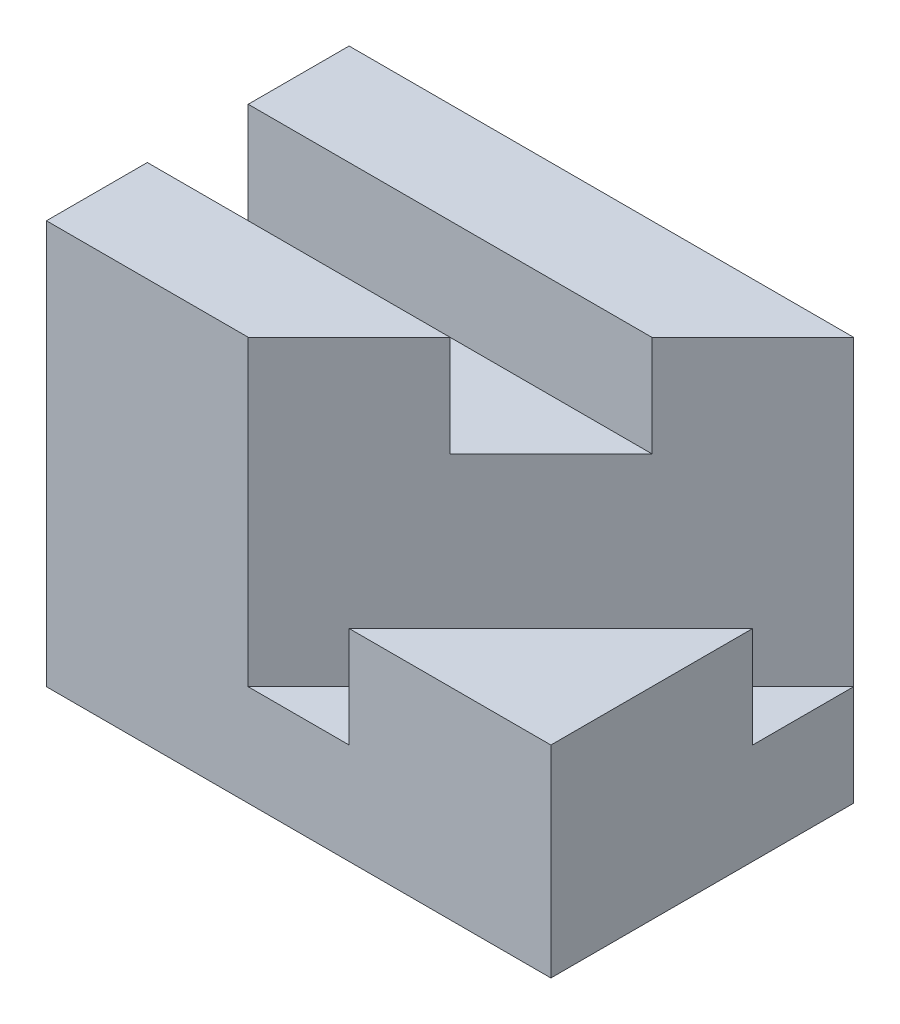
ISO-10303-21;
HEADER;
FILE_DESCRIPTION(('STEP AP214'),'2;1');
FILE_NAME('part.step','',(''),(''),'','','');
FILE_SCHEMA(('AUTOMOTIVE_DESIGN { 1 0 10303 214 1 1 1 1 }'));
ENDSEC;
DATA;
#1=APPLICATION_CONTEXT('core data for automotive mechanical design processes');
#2=APPLICATION_PROTOCOL_DEFINITION('international standard','automotive_design',2000,#1);
#3=PRODUCT_CONTEXT('',#1,'mechanical');
#4=PRODUCT('Part','Part','',(#3));
#5=PRODUCT_RELATED_PRODUCT_CATEGORY('part','',(#4));
#6=PRODUCT_DEFINITION_FORMATION('','',#4);
#7=PRODUCT_DEFINITION_CONTEXT('part definition',#1,'design');
#8=PRODUCT_DEFINITION('design','',#6,#7);
#9=PRODUCT_DEFINITION_SHAPE('','',#8);
#10=(LENGTH_UNIT() NAMED_UNIT(*) SI_UNIT(.MILLI.,.METRE.));
#11=(NAMED_UNIT(*) PLANE_ANGLE_UNIT() SI_UNIT($,.RADIAN.));
#12=(NAMED_UNIT(*) SI_UNIT($,.STERADIAN.) SOLID_ANGLE_UNIT());
#13=UNCERTAINTY_MEASURE_WITH_UNIT(LENGTH_MEASURE(1.E-05),#10,'distance_accuracy_value','');
#14=(GEOMETRIC_REPRESENTATION_CONTEXT(3) GLOBAL_UNCERTAINTY_ASSIGNED_CONTEXT((#13)) GLOBAL_UNIT_ASSIGNED_CONTEXT((#10,
#11,#12)) REPRESENTATION_CONTEXT('',''));
#15=CARTESIAN_POINT('',(0.,0.,0.));
#16=DIRECTION('',(0.,0.,1.));
#17=DIRECTION('',(1.,0.,0.));
#18=AXIS2_PLACEMENT_3D('',#15,#16,#17);
#19=CARTESIAN_POINT('',(25.,40.,-15.));
#20=DIRECTION('',(-1.,0.,0.));
#21=DIRECTION('',(0.,0.,1.));
#22=AXIS2_PLACEMENT_3D('',#19,#20,#21);
#23=PLANE('',#22);
#24=DIRECTION('',(0.,0.,-1.));
#25=VECTOR('',#24,1.);
#26=CARTESIAN_POINT('',(25.,20.,0.));
#27=LINE('',#26,#25);
#28=CARTESIAN_POINT('',(25.,20.,15.));
#29=VERTEX_POINT('',#28);
#30=CARTESIAN_POINT('',(25.,20.,-5.));
#31=VERTEX_POINT('',#30);
#32=EDGE_CURVE('E54',#29,#31,#27,.T.);
#33=ORIENTED_EDGE('',*,*,#32,.F.);
#34=DIRECTION('',(0.,-1.,0.));
#35=VECTOR('',#34,1.);
#36=CARTESIAN_POINT('',(25.,40.,15.));
#37=LINE('',#36,#35);
#38=CARTESIAN_POINT('',(25.,0.,15.));
#39=VERTEX_POINT('',#38);
#40=EDGE_CURVE('E45',#29,#39,#37,.T.);
#41=ORIENTED_EDGE('',*,*,#40,.T.);
#42=DIRECTION('',(0.,0.,-1.));
#43=VECTOR('',#42,1.);
#44=CARTESIAN_POINT('',(25.,0.,-15.));
#45=LINE('',#44,#43);
#46=CARTESIAN_POINT('',(25.,0.,-15.));
#47=VERTEX_POINT('',#46);
#48=EDGE_CURVE('E87',#39,#47,#45,.T.);
#49=ORIENTED_EDGE('',*,*,#48,.T.);
#50=DIRECTION('',(0.,-1.,0.));
#51=VECTOR('',#50,1.);
#52=CARTESIAN_POINT('',(25.,40.,-15.));
#53=LINE('',#52,#51);
#54=CARTESIAN_POINT('',(25.,10.,-15.));
#55=VERTEX_POINT('',#54);
#56=EDGE_CURVE('E50',#55,#47,#53,.T.);
#57=ORIENTED_EDGE('',*,*,#56,.F.);
#58=DIRECTION('',(0.,0.,-1.));
#59=VECTOR('',#58,1.);
#60=CARTESIAN_POINT('',(25.,10.,0.));
#61=LINE('',#60,#59);
#62=CARTESIAN_POINT('',(25.,10.,-5.));
#63=VERTEX_POINT('',#62);
#64=EDGE_CURVE('E219',#63,#55,#61,.T.);
#65=ORIENTED_EDGE('',*,*,#64,.F.);
#66=DIRECTION('',(0.,1.,0.));
#67=VECTOR('',#66,1.);
#68=CARTESIAN_POINT('',(25.,10.,-5.));
#69=LINE('',#68,#67);
#70=EDGE_CURVE('E122',#63,#31,#69,.T.);
#71=ORIENTED_EDGE('',*,*,#70,.T.);
#72=EDGE_LOOP('',(#33,#41,#49,#57,#65,#71));
#73=FACE_BOUND('',#72,.T.);
#74=ADVANCED_FACE('F39',(#73),#23,.F.);
#75=CARTESIAN_POINT('',(-25.,40.,15.));
#76=DIRECTION('',(0.,0.,-1.));
#77=DIRECTION('',(-1.,0.,0.));
#78=AXIS2_PLACEMENT_3D('',#75,#76,#77);
#79=PLANE('',#78);
#80=DIRECTION('',(1.,0.,0.));
#81=VECTOR('',#80,1.);
#82=CARTESIAN_POINT('',(0.,20.,15.));
#83=LINE('',#82,#81);
#84=CARTESIAN_POINT('',(5.00000000000001,20.,15.));
#85=VERTEX_POINT('',#84);
#86=EDGE_CURVE('E227',#85,#29,#83,.T.);
#87=ORIENTED_EDGE('',*,*,#86,.F.);
#88=DIRECTION('',(0.,1.,0.));
#89=VECTOR('',#88,1.);
#90=CARTESIAN_POINT('',(5.00000000000001,10.,15.));
#91=LINE('',#90,#89);
#92=CARTESIAN_POINT('',(5.00000000000001,10.,15.));
#93=VERTEX_POINT('',#92);
#94=EDGE_CURVE('E121',#93,#85,#91,.T.);
#95=ORIENTED_EDGE('',*,*,#94,.F.);
#96=DIRECTION('',(1.,0.,0.));
#97=VECTOR('',#96,1.);
#98=CARTESIAN_POINT('',(0.,10.,15.));
#99=LINE('',#98,#97);
#100=CARTESIAN_POINT('',(-4.99999999999998,10.,15.));
#101=VERTEX_POINT('',#100);
#102=EDGE_CURVE('E238',#101,#93,#99,.T.);
#103=ORIENTED_EDGE('',*,*,#102,.F.);
#104=DIRECTION('',(0.,1.,0.));
#105=VECTOR('',#104,1.);
#106=CARTESIAN_POINT('',(-4.99999999999998,10.,15.));
#107=LINE('',#106,#105);
#108=CARTESIAN_POINT('',(-4.99999999999998,40.,15.));
#109=VERTEX_POINT('',#108);
#110=EDGE_CURVE('E129',#101,#109,#107,.T.);
#111=ORIENTED_EDGE('',*,*,#110,.T.);
#112=DIRECTION('',(1.,0.,0.));
#113=VECTOR('',#112,1.);
#114=CARTESIAN_POINT('',(-25.,40.,15.));
#115=LINE('',#114,#113);
#116=CARTESIAN_POINT('',(-25.,40.,15.));
#117=VERTEX_POINT('',#116);
#118=EDGE_CURVE('E91',#117,#109,#115,.T.);
#119=ORIENTED_EDGE('',*,*,#118,.F.);
#120=DIRECTION('',(0.,-1.,0.));
#121=VECTOR('',#120,1.);
#122=CARTESIAN_POINT('',(-25.,40.,15.));
#123=LINE('',#122,#121);
#124=CARTESIAN_POINT('',(-25.,0.,15.));
#125=VERTEX_POINT('',#124);
#126=EDGE_CURVE('E95',#117,#125,#123,.T.);
#127=ORIENTED_EDGE('',*,*,#126,.T.);
#128=DIRECTION('',(1.,0.,0.));
#129=VECTOR('',#128,1.);
#130=CARTESIAN_POINT('',(-25.,0.,15.));
#131=LINE('',#130,#129);
#132=EDGE_CURVE('E96',#125,#39,#131,.T.);
#133=ORIENTED_EDGE('',*,*,#132,.T.);
#134=ORIENTED_EDGE('',*,*,#40,.F.);
#135=EDGE_LOOP('',(#87,#95,#103,#111,#119,#127,#133,#134));
#136=FACE_BOUND('',#135,.T.);
#137=ADVANCED_FACE('F100',(#136),#79,.F.);
#138=CARTESIAN_POINT('',(0.,40.,0.));
#139=DIRECTION('',(0.,1.,0.));
#140=DIRECTION('',(0.,0.,1.));
#141=AXIS2_PLACEMENT_3D('',#138,#139,#140);
#142=PLANE('',#141);
#143=ORIENTED_EDGE('',*,*,#118,.T.);
#144=DIRECTION('',(0.707106781186547,0.,-0.707106781186548));
#145=VECTOR('',#144,1.);
#146=CARTESIAN_POINT('',(5.00000000000001,40.,5.00000000000001));
#147=LINE('',#146,#145);
#148=CARTESIAN_POINT('',(5.00000000000002,40.,4.99999999999999));
#149=VERTEX_POINT('',#148);
#150=EDGE_CURVE('E145',#109,#149,#147,.T.);
#151=ORIENTED_EDGE('',*,*,#150,.T.);
#152=DIRECTION('',(-1.,0.,0.));
#153=VECTOR('',#152,1.);
#154=CARTESIAN_POINT('',(0.,40.,5.));
#155=LINE('',#154,#153);
#156=CARTESIAN_POINT('',(-25.,40.,5.));
#157=VERTEX_POINT('',#156);
#158=EDGE_CURVE('E132',#149,#157,#155,.T.);
#159=ORIENTED_EDGE('',*,*,#158,.T.);
#160=DIRECTION('',(0.,0.,1.));
#161=VECTOR('',#160,1.);
#162=CARTESIAN_POINT('',(-25.,40.,-15.));
#163=LINE('',#162,#161);
#164=EDGE_CURVE('E63',#157,#117,#163,.T.);
#165=ORIENTED_EDGE('',*,*,#164,.T.);
#166=EDGE_LOOP('',(#143,#151,#159,#165));
#167=FACE_BOUND('',#166,.T.);
#168=ADVANCED_FACE('F172',(#167),#142,.T.);
#169=DIRECTION('',(-1.,0.,0.));
#170=VECTOR('',#169,1.);
#171=CARTESIAN_POINT('',(0.,40.,-5.00000000000001));
#172=LINE('',#171,#170);
#173=CARTESIAN_POINT('',(15.,40.,-5.00000000000001));
#174=VERTEX_POINT('',#173);
#175=CARTESIAN_POINT('',(-25.,40.,-5.00000000000001));
#176=VERTEX_POINT('',#175);
#177=EDGE_CURVE('E139',#174,#176,#172,.T.);
#178=ORIENTED_EDGE('',*,*,#177,.F.);
#179=CARTESIAN_POINT('',(25.,40.,-15.));
#180=VERTEX_POINT('',#179);
#181=EDGE_CURVE('E243',#174,#180,#147,.T.);
#182=ORIENTED_EDGE('',*,*,#181,.T.);
#183=DIRECTION('',(-1.,0.,0.));
#184=VECTOR('',#183,1.);
#185=CARTESIAN_POINT('',(-25.,40.,-15.));
#186=LINE('',#185,#184);
#187=CARTESIAN_POINT('',(-25.,40.,-15.));
#188=VERTEX_POINT('',#187);
#189=EDGE_CURVE('E101',#180,#188,#186,.T.);
#190=ORIENTED_EDGE('',*,*,#189,.T.);
#191=EDGE_CURVE('E169',#188,#176,#163,.T.);
#192=ORIENTED_EDGE('',*,*,#191,.T.);
#193=EDGE_LOOP('',(#178,#182,#190,#192));
#194=FACE_BOUND('',#193,.T.);
#195=ADVANCED_FACE('F248',(#194),#142,.T.);
#196=CARTESIAN_POINT('',(-25.,40.,-15.));
#197=DIRECTION('',(0.,0.,1.));
#198=DIRECTION('',(1.,0.,0.));
#199=AXIS2_PLACEMENT_3D('',#196,#197,#198);
#200=PLANE('',#199);
#201=DIRECTION('',(-1.,0.,0.));
#202=VECTOR('',#201,1.);
#203=CARTESIAN_POINT('',(-25.,0.,-15.));
#204=LINE('',#203,#202);
#205=CARTESIAN_POINT('',(-25.,0.,-15.));
#206=VERTEX_POINT('',#205);
#207=EDGE_CURVE('E106',#47,#206,#204,.T.);
#208=ORIENTED_EDGE('',*,*,#207,.T.);
#209=DIRECTION('',(0.,-1.,0.));
#210=VECTOR('',#209,1.);
#211=CARTESIAN_POINT('',(-25.,40.,-15.));
#212=LINE('',#211,#210);
#213=EDGE_CURVE('E120',#188,#206,#212,.T.);
#214=ORIENTED_EDGE('',*,*,#213,.F.);
#215=ORIENTED_EDGE('',*,*,#189,.F.);
#216=EDGE_CURVE('E11',#180,#55,#53,.T.);
#217=ORIENTED_EDGE('',*,*,#216,.T.);
#218=ORIENTED_EDGE('',*,*,#56,.T.);
#219=EDGE_LOOP('',(#208,#214,#215,#217,#218));
#220=FACE_BOUND('',#219,.T.);
#221=ADVANCED_FACE('F220',(#220),#200,.F.);
#222=CARTESIAN_POINT('',(-25.,40.,-15.));
#223=DIRECTION('',(1.,0.,0.));
#224=DIRECTION('',(0.,0.,-1.));
#225=AXIS2_PLACEMENT_3D('',#222,#223,#224);
#226=PLANE('',#225);
#227=DIRECTION('',(0.,0.,1.));
#228=VECTOR('',#227,1.);
#229=CARTESIAN_POINT('',(-25.,30.,0.));
#230=LINE('',#229,#228);
#231=CARTESIAN_POINT('',(-25.,30.,-5.00000000000001));
#232=VERTEX_POINT('',#231);
#233=CARTESIAN_POINT('',(-25.,30.,5.));
#234=VERTEX_POINT('',#233);
#235=EDGE_CURVE('E154',#232,#234,#230,.T.);
#236=ORIENTED_EDGE('',*,*,#235,.F.);
#237=DIRECTION('',(0.,1.,0.));
#238=VECTOR('',#237,1.);
#239=CARTESIAN_POINT('',(-25.,30.,-5.00000000000001));
#240=LINE('',#239,#238);
#241=EDGE_CURVE('E112',#232,#176,#240,.T.);
#242=ORIENTED_EDGE('',*,*,#241,.T.);
#243=ORIENTED_EDGE('',*,*,#191,.F.);
#244=ORIENTED_EDGE('',*,*,#213,.T.);
#245=DIRECTION('',(0.,0.,1.));
#246=VECTOR('',#245,1.);
#247=CARTESIAN_POINT('',(-25.,0.,-15.));
#248=LINE('',#247,#246);
#249=EDGE_CURVE('E105',#206,#125,#248,.T.);
#250=ORIENTED_EDGE('',*,*,#249,.T.);
#251=ORIENTED_EDGE('',*,*,#126,.F.);
#252=ORIENTED_EDGE('',*,*,#164,.F.);
#253=DIRECTION('',(0.,1.,0.));
#254=VECTOR('',#253,1.);
#255=CARTESIAN_POINT('',(-25.,30.,5.));
#256=LINE('',#255,#254);
#257=EDGE_CURVE('E110',#234,#157,#256,.T.);
#258=ORIENTED_EDGE('',*,*,#257,.F.);
#259=EDGE_LOOP('',(#236,#242,#243,#244,#250,#251,#252,#258));
#260=FACE_BOUND('',#259,.T.);
#261=ADVANCED_FACE('F213',(#260),#226,.F.);
#262=CARTESIAN_POINT('',(0.,0.,0.));
#263=DIRECTION('',(0.,1.,0.));
#264=DIRECTION('',(0.,0.,1.));
#265=AXIS2_PLACEMENT_3D('',#262,#263,#264);
#266=PLANE('',#265);
#267=ORIENTED_EDGE('',*,*,#48,.F.);
#268=ORIENTED_EDGE('',*,*,#132,.F.);
#269=ORIENTED_EDGE('',*,*,#249,.F.);
#270=ORIENTED_EDGE('',*,*,#207,.F.);
#271=EDGE_LOOP('',(#267,#268,#269,#270));
#272=FACE_BOUND('',#271,.T.);
#273=ADVANCED_FACE('F104',(#272),#266,.F.);
#274=CARTESIAN_POINT('',(0.,30.,5.));
#275=DIRECTION('',(0.,0.,-1.));
#276=DIRECTION('',(-1.,0.,0.));
#277=AXIS2_PLACEMENT_3D('',#274,#275,#276);
#278=PLANE('',#277);
#279=ORIENTED_EDGE('',*,*,#158,.F.);
#280=DIRECTION('',(0.,1.,0.));
#281=VECTOR('',#280,1.);
#282=CARTESIAN_POINT('',(5.00000000000002,30.,5.));
#283=LINE('',#282,#281);
#284=CARTESIAN_POINT('',(5.00000000000002,30.,5.));
#285=VERTEX_POINT('',#284);
#286=EDGE_CURVE('E160',#285,#149,#283,.T.);
#287=ORIENTED_EDGE('',*,*,#286,.F.);
#288=DIRECTION('',(-1.,0.,0.));
#289=VECTOR('',#288,1.);
#290=CARTESIAN_POINT('',(0.,30.,5.));
#291=LINE('',#290,#289);
#292=EDGE_CURVE('E148',#285,#234,#291,.T.);
#293=ORIENTED_EDGE('',*,*,#292,.T.);
#294=ORIENTED_EDGE('',*,*,#257,.T.);
#295=EDGE_LOOP('',(#279,#287,#293,#294));
#296=FACE_BOUND('',#295,.T.);
#297=ADVANCED_FACE('F208',(#296),#278,.T.);
#298=CARTESIAN_POINT('',(0.,30.,-5.00000000000001));
#299=DIRECTION('',(0.,0.,-1.));
#300=DIRECTION('',(-1.,0.,0.));
#301=AXIS2_PLACEMENT_3D('',#298,#299,#300);
#302=PLANE('',#301);
#303=ORIENTED_EDGE('',*,*,#177,.T.);
#304=ORIENTED_EDGE('',*,*,#241,.F.);
#305=DIRECTION('',(-1.,0.,0.));
#306=VECTOR('',#305,1.);
#307=CARTESIAN_POINT('',(0.,30.,-5.00000000000001));
#308=LINE('',#307,#306);
#309=CARTESIAN_POINT('',(15.,30.,-5.00000000000001));
#310=VERTEX_POINT('',#309);
#311=EDGE_CURVE('E155',#310,#232,#308,.T.);
#312=ORIENTED_EDGE('',*,*,#311,.F.);
#313=DIRECTION('',(0.,1.,0.));
#314=VECTOR('',#313,1.);
#315=CARTESIAN_POINT('',(15.,30.,-5.00000000000001));
#316=LINE('',#315,#314);
#317=EDGE_CURVE('E162',#310,#174,#316,.T.);
#318=ORIENTED_EDGE('',*,*,#317,.T.);
#319=EDGE_LOOP('',(#303,#304,#312,#318));
#320=FACE_BOUND('',#319,.T.);
#321=ADVANCED_FACE('F252',(#320),#302,.F.);
#322=CARTESIAN_POINT('',(0.,30.,0.));
#323=DIRECTION('',(0.,1.,0.));
#324=DIRECTION('',(0.,0.,1.));
#325=AXIS2_PLACEMENT_3D('',#322,#323,#324);
#326=PLANE('',#325);
#327=ORIENTED_EDGE('',*,*,#292,.F.);
#328=DIRECTION('',(0.707106781186547,0.,-0.707106781186548));
#329=VECTOR('',#328,1.);
#330=CARTESIAN_POINT('',(5.00000000000001,30.,5.00000000000001));
#331=LINE('',#330,#329);
#332=EDGE_CURVE('E149',#285,#310,#331,.T.);
#333=ORIENTED_EDGE('',*,*,#332,.T.);
#334=ORIENTED_EDGE('',*,*,#311,.T.);
#335=ORIENTED_EDGE('',*,*,#235,.T.);
#336=EDGE_LOOP('',(#327,#333,#334,#335));
#337=FACE_BOUND('',#336,.T.);
#338=ADVANCED_FACE('F255',(#337),#326,.T.);
#339=CARTESIAN_POINT('',(5.00000000000001,10.,5.00000000000001));
#340=DIRECTION('',(0.707106781186548,0.,0.707106781186547));
#341=DIRECTION('',(0.707106781186547,0.,-0.707106781186548));
#342=AXIS2_PLACEMENT_3D('',#339,#340,#341);
#343=PLANE('',#342);
#344=ORIENTED_EDGE('',*,*,#332,.F.);
#345=ORIENTED_EDGE('',*,*,#286,.T.);
#346=ORIENTED_EDGE('',*,*,#150,.F.);
#347=ORIENTED_EDGE('',*,*,#110,.F.);
#348=DIRECTION('',(0.707106781186547,0.,-0.707106781186548));
#349=VECTOR('',#348,1.);
#350=CARTESIAN_POINT('',(5.00000000000001,10.,5.00000000000001));
#351=LINE('',#350,#349);
#352=EDGE_CURVE('E124',#101,#55,#351,.T.);
#353=ORIENTED_EDGE('',*,*,#352,.T.);
#354=ORIENTED_EDGE('',*,*,#216,.F.);
#355=ORIENTED_EDGE('',*,*,#181,.F.);
#356=ORIENTED_EDGE('',*,*,#317,.F.);
#357=EDGE_LOOP('',(#344,#345,#346,#347,#353,#354,#355,#356));
#358=FACE_BOUND('',#357,.T.);
#359=ADVANCED_FACE('F247',(#358),#343,.T.);
#360=CARTESIAN_POINT('',(10.,10.,10.));
#361=DIRECTION('',(0.707106781186548,0.,0.707106781186547));
#362=DIRECTION('',(0.707106781186547,0.,-0.707106781186548));
#363=AXIS2_PLACEMENT_3D('',#360,#361,#362);
#364=PLANE('',#363);
#365=ORIENTED_EDGE('',*,*,#94,.T.);
#366=DIRECTION('',(0.707106781186547,0.,-0.707106781186548));
#367=VECTOR('',#366,1.);
#368=CARTESIAN_POINT('',(10.,20.,10.));
#369=LINE('',#368,#367);
#370=EDGE_CURVE('E230',#85,#31,#369,.T.);
#371=ORIENTED_EDGE('',*,*,#370,.T.);
#372=ORIENTED_EDGE('',*,*,#70,.F.);
#373=DIRECTION('',(0.707106781186547,0.,-0.707106781186548));
#374=VECTOR('',#373,1.);
#375=CARTESIAN_POINT('',(10.,10.,10.));
#376=LINE('',#375,#374);
#377=EDGE_CURVE('E240',#93,#63,#376,.T.);
#378=ORIENTED_EDGE('',*,*,#377,.F.);
#379=EDGE_LOOP('',(#365,#371,#372,#378));
#380=FACE_BOUND('',#379,.T.);
#381=ADVANCED_FACE('F234',(#380),#364,.F.);
#382=CARTESIAN_POINT('',(0.,10.,0.));
#383=DIRECTION('',(0.,1.,0.));
#384=DIRECTION('',(0.,0.,1.));
#385=AXIS2_PLACEMENT_3D('',#382,#383,#384);
#386=PLANE('',#385);
#387=ORIENTED_EDGE('',*,*,#102,.T.);
#388=ORIENTED_EDGE('',*,*,#377,.T.);
#389=ORIENTED_EDGE('',*,*,#64,.T.);
#390=ORIENTED_EDGE('',*,*,#352,.F.);
#391=EDGE_LOOP('',(#387,#388,#389,#390));
#392=FACE_BOUND('',#391,.T.);
#393=ADVANCED_FACE('F241',(#392),#386,.T.);
#394=CARTESIAN_POINT('',(0.,20.,0.));
#395=DIRECTION('',(0.,1.,0.));
#396=DIRECTION('',(0.,0.,1.));
#397=AXIS2_PLACEMENT_3D('',#394,#395,#396);
#398=PLANE('',#397);
#399=ORIENTED_EDGE('',*,*,#370,.F.);
#400=ORIENTED_EDGE('',*,*,#86,.T.);
#401=ORIENTED_EDGE('',*,*,#32,.T.);
#402=EDGE_LOOP('',(#399,#400,#401));
#403=FACE_BOUND('',#402,.T.);
#404=ADVANCED_FACE('F228',(#403),#398,.T.);
#405=CLOSED_SHELL('',(#74,#137,#168,#195,#221,#261,#273,#297,#321,#338,#359,#381,#393,#404));
#406=MANIFOLD_SOLID_BREP('B2',#405);
#407=ADVANCED_BREP_SHAPE_REPRESENTATION('',(#18,#406),#14);
#408=SHAPE_DEFINITION_REPRESENTATION(#9,#407);
ENDSEC;
END-ISO-10303-21;
